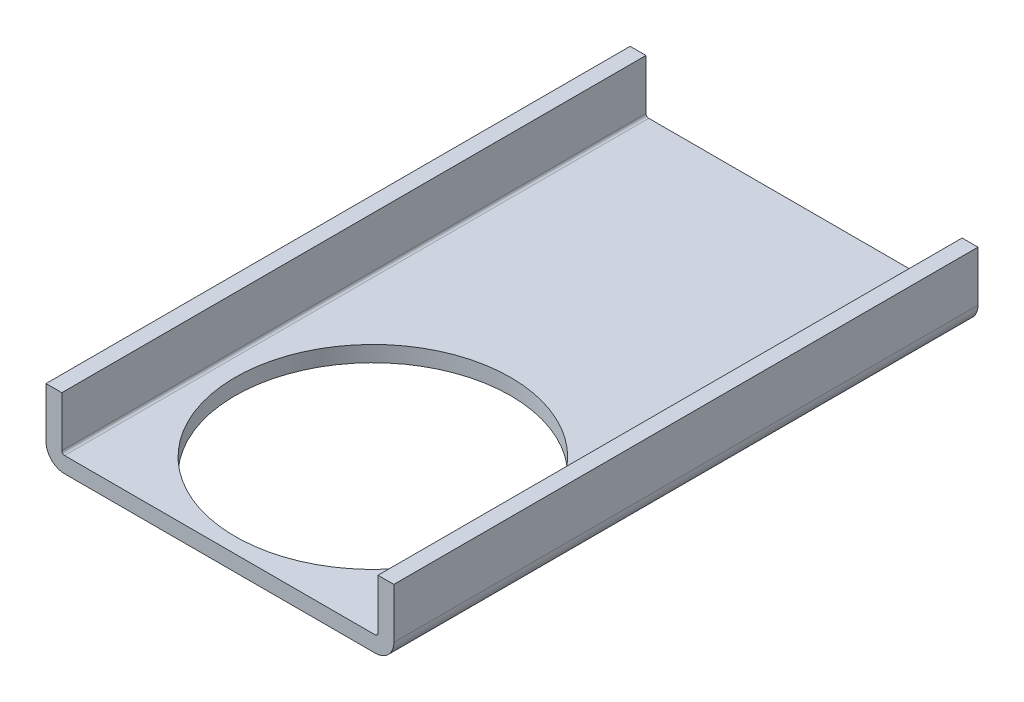
ISO-10303-21;
HEADER;
FILE_DESCRIPTION(('STEP AP214'),'2;1');
FILE_NAME('part.step','',(''),(''),'','','');
FILE_SCHEMA(('AUTOMOTIVE_DESIGN { 1 0 10303 214 1 1 1 1 }'));
ENDSEC;
DATA;
#1=APPLICATION_CONTEXT('core data for automotive mechanical design processes');
#2=APPLICATION_PROTOCOL_DEFINITION('international standard','automotive_design',2000,#1);
#3=PRODUCT_CONTEXT('',#1,'mechanical');
#4=PRODUCT('Part','Part','',(#3));
#5=PRODUCT_RELATED_PRODUCT_CATEGORY('part','',(#4));
#6=PRODUCT_DEFINITION_FORMATION('','',#4);
#7=PRODUCT_DEFINITION_CONTEXT('part definition',#1,'design');
#8=PRODUCT_DEFINITION('design','',#6,#7);
#9=PRODUCT_DEFINITION_SHAPE('','',#8);
#10=(LENGTH_UNIT() NAMED_UNIT(*) SI_UNIT(.MILLI.,.METRE.));
#11=(NAMED_UNIT(*) PLANE_ANGLE_UNIT() SI_UNIT($,.RADIAN.));
#12=(NAMED_UNIT(*) SI_UNIT($,.STERADIAN.) SOLID_ANGLE_UNIT());
#13=UNCERTAINTY_MEASURE_WITH_UNIT(LENGTH_MEASURE(1.E-05),#10,'distance_accuracy_value','');
#14=(GEOMETRIC_REPRESENTATION_CONTEXT(3) GLOBAL_UNCERTAINTY_ASSIGNED_CONTEXT((#13)) GLOBAL_UNIT_ASSIGNED_CONTEXT((#10,
#11,#12)) REPRESENTATION_CONTEXT('',''));
#15=CARTESIAN_POINT('',(0.,0.,0.));
#16=DIRECTION('',(0.,0.,1.));
#17=DIRECTION('',(1.,0.,0.));
#18=AXIS2_PLACEMENT_3D('',#15,#16,#17);
#19=CARTESIAN_POINT('',(28.6385,0.507999999999995,29.464));
#20=DIRECTION('',(0.,0.,-1.));
#21=DIRECTION('',(-1.,0.,0.));
#22=AXIS2_PLACEMENT_3D('',#19,#20,#21);
#23=CYLINDRICAL_SURFACE('',#22,0.508000000000002);
#24=CARTESIAN_POINT('',(28.6385,0.507999999999993,-79.502));
#25=DIRECTION('',(0.,0.,-1.));
#26=DIRECTION('',(-1.,0.,0.));
#27=AXIS2_PLACEMENT_3D('',#24,#25,#26);
#28=CIRCLE('',#27,0.508000000000002);
#29=CARTESIAN_POINT('',(28.6385,0.,-79.502));
#30=VERTEX_POINT('',#29);
#31=CARTESIAN_POINT('',(29.1465,0.507999999999994,-79.502));
#32=VERTEX_POINT('',#31);
#33=EDGE_CURVE('E93',#30,#32,#28,.F.);
#34=ORIENTED_EDGE('',*,*,#33,.F.);
#35=DIRECTION('',(0.,0.,-1.));
#36=VECTOR('',#35,1.);
#37=CARTESIAN_POINT('',(28.6385,0.,29.464));
#38=LINE('',#37,#36);
#39=CARTESIAN_POINT('',(28.6385,0.,28.194));
#40=VERTEX_POINT('',#39);
#41=EDGE_CURVE('E95',#30,#40,#38,.F.);
#42=ORIENTED_EDGE('',*,*,#41,.T.);
#43=CARTESIAN_POINT('',(28.6385,0.507999999999995,28.194));
#44=DIRECTION('',(0.,0.,-1.));
#45=DIRECTION('',(-1.,0.,0.));
#46=AXIS2_PLACEMENT_3D('',#43,#44,#45);
#47=CIRCLE('',#46,0.508000000000002);
#48=CARTESIAN_POINT('',(29.1465,0.507999999999995,28.194));
#49=VERTEX_POINT('',#48);
#50=EDGE_CURVE('E19',#49,#40,#47,.T.);
#51=ORIENTED_EDGE('',*,*,#50,.F.);
#52=DIRECTION('',(0.,0.,-1.));
#53=VECTOR('',#52,1.);
#54=CARTESIAN_POINT('',(29.1465,0.507999999999995,29.464));
#55=LINE('',#54,#53);
#56=EDGE_CURVE('E147',#49,#32,#55,.T.);
#57=ORIENTED_EDGE('',*,*,#56,.T.);
#58=EDGE_LOOP('',(#34,#42,#51,#57));
#59=FACE_BOUND('',#58,.T.);
#60=ADVANCED_FACE('F16',(#59),#23,.F.);
#61=CARTESIAN_POINT('',(-28.6385000000001,0.507999999999989,29.464));
#62=DIRECTION('',(0.,0.,-1.));
#63=DIRECTION('',(-1.,0.,0.));
#64=AXIS2_PLACEMENT_3D('',#61,#62,#63);
#65=CYLINDRICAL_SURFACE('',#64,0.508000000000002);
#66=CARTESIAN_POINT('',(-28.6385,0.507999999999988,-79.5020000000001));
#67=DIRECTION('',(0.,0.,-1.));
#68=DIRECTION('',(-1.,0.,0.));
#69=AXIS2_PLACEMENT_3D('',#66,#67,#68);
#70=CIRCLE('',#69,0.508000000000002);
#71=CARTESIAN_POINT('',(-29.1465,0.507999999999989,-79.502));
#72=VERTEX_POINT('',#71);
#73=CARTESIAN_POINT('',(-28.6385,0.,-79.502));
#74=VERTEX_POINT('',#73);
#75=EDGE_CURVE('E162',#72,#74,#70,.F.);
#76=ORIENTED_EDGE('',*,*,#75,.F.);
#77=DIRECTION('',(0.,0.,1.));
#78=VECTOR('',#77,1.);
#79=CARTESIAN_POINT('',(-29.1465,0.507999999999989,29.464));
#80=LINE('',#79,#78);
#81=CARTESIAN_POINT('',(-29.1465,0.50799999999999,28.194));
#82=VERTEX_POINT('',#81);
#83=EDGE_CURVE('E99',#72,#82,#80,.T.);
#84=ORIENTED_EDGE('',*,*,#83,.T.);
#85=CARTESIAN_POINT('',(-28.6385000000001,0.507999999999989,28.194));
#86=DIRECTION('',(0.,0.,-1.));
#87=DIRECTION('',(-1.,0.,0.));
#88=AXIS2_PLACEMENT_3D('',#85,#86,#87);
#89=CIRCLE('',#88,0.508000000000002);
#90=CARTESIAN_POINT('',(-28.6385,0.,28.194));
#91=VERTEX_POINT('',#90);
#92=EDGE_CURVE('E192',#91,#82,#89,.T.);
#93=ORIENTED_EDGE('',*,*,#92,.F.);
#94=DIRECTION('',(0.,0.,-1.));
#95=VECTOR('',#94,1.);
#96=CARTESIAN_POINT('',(-28.6385,0.,29.464));
#97=LINE('',#96,#95);
#98=EDGE_CURVE('E100',#91,#74,#97,.T.);
#99=ORIENTED_EDGE('',*,*,#98,.T.);
#100=EDGE_LOOP('',(#76,#84,#93,#99));
#101=FACE_BOUND('',#100,.T.);
#102=ADVANCED_FACE('F297',(#101),#65,.F.);
#103=CARTESIAN_POINT('',(32.0675,0.507999999999993,29.464));
#104=DIRECTION('',(-1.,0.,0.));
#105=DIRECTION('',(0.,0.,1.));
#106=AXIS2_PLACEMENT_3D('',#103,#104,#105);
#107=PLANE('',#106);
#108=DIRECTION('',(0.,1.,0.));
#109=VECTOR('',#108,1.);
#110=CARTESIAN_POINT('',(32.0675,22.479,-79.502));
#111=LINE('',#110,#109);
#112=CARTESIAN_POINT('',(32.0675,0.507999999999994,-79.502));
#113=VERTEX_POINT('',#112);
#114=CARTESIAN_POINT('',(32.0675,9.77899999999999,-79.502));
#115=VERTEX_POINT('',#114);
#116=EDGE_CURVE('E157',#113,#115,#111,.T.);
#117=ORIENTED_EDGE('',*,*,#116,.T.);
#118=DIRECTION('',(0.,0.,-1.));
#119=VECTOR('',#118,1.);
#120=CARTESIAN_POINT('',(32.0675,9.77899999999999,29.464));
#121=LINE('',#120,#119);
#122=CARTESIAN_POINT('',(32.0675,9.77899999999999,28.194));
#123=VERTEX_POINT('',#122);
#124=EDGE_CURVE('E149',#115,#123,#121,.F.);
#125=ORIENTED_EDGE('',*,*,#124,.T.);
#126=DIRECTION('',(0.,1.,0.));
#127=VECTOR('',#126,1.);
#128=CARTESIAN_POINT('',(32.0675,22.479,28.194));
#129=LINE('',#128,#127);
#130=CARTESIAN_POINT('',(32.0675,0.507999999999995,28.194));
#131=VERTEX_POINT('',#130);
#132=EDGE_CURVE('E168',#123,#131,#129,.F.);
#133=ORIENTED_EDGE('',*,*,#132,.T.);
#134=DIRECTION('',(0.,0.,-1.));
#135=VECTOR('',#134,1.);
#136=CARTESIAN_POINT('',(32.0675,0.507999999999995,29.464));
#137=LINE('',#136,#135);
#138=EDGE_CURVE('E165',#113,#131,#137,.F.);
#139=ORIENTED_EDGE('',*,*,#138,.F.);
#140=EDGE_LOOP('',(#117,#125,#133,#139));
#141=FACE_BOUND('',#140,.T.);
#142=ADVANCED_FACE('F225',(#141),#107,.F.);
#143=CARTESIAN_POINT('',(32.0675,9.77899999999999,29.464));
#144=DIRECTION('',(0.,-1.,0.));
#145=DIRECTION('',(0.,0.,-1.));
#146=AXIS2_PLACEMENT_3D('',#143,#144,#145);
#147=PLANE('',#146);
#148=DIRECTION('',(1.,0.,0.));
#149=VECTOR('',#148,1.);
#150=CARTESIAN_POINT('',(50.8,9.779,-79.502));
#151=LINE('',#150,#149);
#152=CARTESIAN_POINT('',(29.1465,9.77899999999999,-79.502));
#153=VERTEX_POINT('',#152);
#154=EDGE_CURVE('E153',#115,#153,#151,.F.);
#155=ORIENTED_EDGE('',*,*,#154,.T.);
#156=DIRECTION('',(0.,0.,-1.));
#157=VECTOR('',#156,1.);
#158=CARTESIAN_POINT('',(29.1465,9.77899999999999,29.464));
#159=LINE('',#158,#157);
#160=CARTESIAN_POINT('',(29.1465,9.77899999999999,28.194));
#161=VERTEX_POINT('',#160);
#162=EDGE_CURVE('E146',#153,#161,#159,.F.);
#163=ORIENTED_EDGE('',*,*,#162,.T.);
#164=DIRECTION('',(-1.,0.,0.));
#165=VECTOR('',#164,1.);
#166=CARTESIAN_POINT('',(50.8,9.77899999999999,28.194));
#167=LINE('',#166,#165);
#168=EDGE_CURVE('E108',#161,#123,#167,.F.);
#169=ORIENTED_EDGE('',*,*,#168,.T.);
#170=ORIENTED_EDGE('',*,*,#124,.F.);
#171=EDGE_LOOP('',(#155,#163,#169,#170));
#172=FACE_BOUND('',#171,.T.);
#173=ADVANCED_FACE('F293',(#172),#147,.F.);
#174=CARTESIAN_POINT('',(29.1465,0.507999999999995,29.464));
#175=DIRECTION('',(1.,0.,0.));
#176=DIRECTION('',(0.,0.,-1.));
#177=AXIS2_PLACEMENT_3D('',#174,#175,#176);
#178=PLANE('',#177);
#179=DIRECTION('',(0.,1.,0.));
#180=VECTOR('',#179,1.);
#181=CARTESIAN_POINT('',(29.1465,22.479,-79.502));
#182=LINE('',#181,#180);
#183=EDGE_CURVE('E156',#153,#32,#182,.F.);
#184=ORIENTED_EDGE('',*,*,#183,.T.);
#185=ORIENTED_EDGE('',*,*,#56,.F.);
#186=DIRECTION('',(0.,1.,0.));
#187=VECTOR('',#186,1.);
#188=CARTESIAN_POINT('',(29.1465,22.479,28.194));
#189=LINE('',#188,#187);
#190=EDGE_CURVE('E92',#49,#161,#189,.T.);
#191=ORIENTED_EDGE('',*,*,#190,.T.);
#192=ORIENTED_EDGE('',*,*,#162,.F.);
#193=EDGE_LOOP('',(#184,#185,#191,#192));
#194=FACE_BOUND('',#193,.T.);
#195=ADVANCED_FACE('F202',(#194),#178,.F.);
#196=CARTESIAN_POINT('',(28.6385,0.,29.464));
#197=DIRECTION('',(0.,-1.,0.));
#198=DIRECTION('',(0.,0.,-1.));
#199=AXIS2_PLACEMENT_3D('',#196,#197,#198);
#200=PLANE('',#199);
#201=DIRECTION('',(1.,0.,0.));
#202=VECTOR('',#201,1.);
#203=CARTESIAN_POINT('',(50.8,0.,-79.502));
#204=LINE('',#203,#202);
#205=EDGE_CURVE('E199',#30,#74,#204,.F.);
#206=ORIENTED_EDGE('',*,*,#205,.T.);
#207=ORIENTED_EDGE('',*,*,#98,.F.);
#208=DIRECTION('',(-1.,0.,0.));
#209=VECTOR('',#208,1.);
#210=CARTESIAN_POINT('',(50.8,0.,28.194));
#211=LINE('',#210,#209);
#212=EDGE_CURVE('E89',#91,#40,#211,.F.);
#213=ORIENTED_EDGE('',*,*,#212,.T.);
#214=ORIENTED_EDGE('',*,*,#41,.F.);
#215=EDGE_LOOP('',(#206,#207,#213,#214));
#216=FACE_BOUND('',#215,.T.);
#217=CARTESIAN_POINT('',(0.,0.,0.));
#218=DIRECTION('',(0.,-1.,0.));
#219=DIRECTION('',(0.,0.,-1.));
#220=AXIS2_PLACEMENT_3D('',#217,#218,#219);
#221=CIRCLE('',#220,25.4);
#222=CARTESIAN_POINT('',(0.,0.,-25.4));
#223=VERTEX_POINT('',#222);
#224=EDGE_CURVE('E121',#223,#223,#221,.T.);
#225=ORIENTED_EDGE('',*,*,#224,.T.);
#226=EDGE_LOOP('',(#225));
#227=FACE_BOUND('',#226,.T.);
#228=ADVANCED_FACE('F103',(#216,#227),#200,.F.);
#229=CARTESIAN_POINT('',(-29.1465,0.507999999999989,29.464));
#230=DIRECTION('',(-1.,0.,0.));
#231=DIRECTION('',(0.,0.,1.));
#232=AXIS2_PLACEMENT_3D('',#229,#230,#231);
#233=PLANE('',#232);
#234=DIRECTION('',(0.,1.,0.));
#235=VECTOR('',#234,1.);
#236=CARTESIAN_POINT('',(-29.1465000000001,22.479,-79.502));
#237=LINE('',#236,#235);
#238=CARTESIAN_POINT('',(-29.1465,9.77899999999999,-79.502));
#239=VERTEX_POINT('',#238);
#240=EDGE_CURVE('E136',#72,#239,#237,.T.);
#241=ORIENTED_EDGE('',*,*,#240,.T.);
#242=DIRECTION('',(0.,0.,-1.));
#243=VECTOR('',#242,1.);
#244=CARTESIAN_POINT('',(-29.1465,9.77899999999999,29.464));
#245=LINE('',#244,#243);
#246=CARTESIAN_POINT('',(-29.1465,9.77899999999999,28.194));
#247=VERTEX_POINT('',#246);
#248=EDGE_CURVE('E130',#239,#247,#245,.F.);
#249=ORIENTED_EDGE('',*,*,#248,.T.);
#250=DIRECTION('',(0.,1.,0.));
#251=VECTOR('',#250,1.);
#252=CARTESIAN_POINT('',(-29.1465,22.479,28.194));
#253=LINE('',#252,#251);
#254=EDGE_CURVE('E106',#247,#82,#253,.F.);
#255=ORIENTED_EDGE('',*,*,#254,.T.);
#256=ORIENTED_EDGE('',*,*,#83,.F.);
#257=EDGE_LOOP('',(#241,#249,#255,#256));
#258=FACE_BOUND('',#257,.T.);
#259=ADVANCED_FACE('F286',(#258),#233,.F.);
#260=CARTESIAN_POINT('',(-32.0675,9.77899999999999,29.464));
#261=DIRECTION('',(0.,-1.,0.));
#262=DIRECTION('',(0.,0.,-1.));
#263=AXIS2_PLACEMENT_3D('',#260,#261,#262);
#264=PLANE('',#263);
#265=DIRECTION('',(1.,0.,0.));
#266=VECTOR('',#265,1.);
#267=CARTESIAN_POINT('',(50.8,9.77899999999999,-79.502));
#268=LINE('',#267,#266);
#269=CARTESIAN_POINT('',(-32.0675,9.77899999999999,-79.502));
#270=VERTEX_POINT('',#269);
#271=EDGE_CURVE('E133',#239,#270,#268,.F.);
#272=ORIENTED_EDGE('',*,*,#271,.T.);
#273=DIRECTION('',(0.,0.,-1.));
#274=VECTOR('',#273,1.);
#275=CARTESIAN_POINT('',(-32.0675,9.77899999999999,29.464));
#276=LINE('',#275,#274);
#277=CARTESIAN_POINT('',(-32.0675,9.77899999999999,28.194));
#278=VERTEX_POINT('',#277);
#279=EDGE_CURVE('E127',#270,#278,#276,.F.);
#280=ORIENTED_EDGE('',*,*,#279,.T.);
#281=DIRECTION('',(-1.,0.,0.));
#282=VECTOR('',#281,1.);
#283=CARTESIAN_POINT('',(50.8,9.77899999999999,28.194));
#284=LINE('',#283,#282);
#285=EDGE_CURVE('E111',#278,#247,#284,.F.);
#286=ORIENTED_EDGE('',*,*,#285,.T.);
#287=ORIENTED_EDGE('',*,*,#248,.F.);
#288=EDGE_LOOP('',(#272,#280,#286,#287));
#289=FACE_BOUND('',#288,.T.);
#290=ADVANCED_FACE('F260',(#289),#264,.F.);
#291=CARTESIAN_POINT('',(-32.0675,0.507999999999991,29.464));
#292=DIRECTION('',(1.,0.,0.));
#293=DIRECTION('',(0.,0.,-1.));
#294=AXIS2_PLACEMENT_3D('',#291,#292,#293);
#295=PLANE('',#294);
#296=DIRECTION('',(0.,1.,0.));
#297=VECTOR('',#296,1.);
#298=CARTESIAN_POINT('',(-32.0675,22.479,-79.502));
#299=LINE('',#298,#297);
#300=CARTESIAN_POINT('',(-32.0675,0.507999999999988,-79.502));
#301=VERTEX_POINT('',#300);
#302=EDGE_CURVE('E126',#270,#301,#299,.F.);
#303=ORIENTED_EDGE('',*,*,#302,.T.);
#304=DIRECTION('',(0.,0.,-1.));
#305=VECTOR('',#304,1.);
#306=CARTESIAN_POINT('',(-32.0675000000001,0.507999999999989,29.464));
#307=LINE('',#306,#305);
#308=CARTESIAN_POINT('',(-32.0675000000001,0.50799999999999,28.194));
#309=VERTEX_POINT('',#308);
#310=EDGE_CURVE('E124',#309,#301,#307,.T.);
#311=ORIENTED_EDGE('',*,*,#310,.F.);
#312=DIRECTION('',(0.,1.,0.));
#313=VECTOR('',#312,1.);
#314=CARTESIAN_POINT('',(-32.0675,22.479,28.194));
#315=LINE('',#314,#313);
#316=EDGE_CURVE('E118',#309,#278,#315,.T.);
#317=ORIENTED_EDGE('',*,*,#316,.T.);
#318=ORIENTED_EDGE('',*,*,#279,.F.);
#319=EDGE_LOOP('',(#303,#311,#317,#318));
#320=FACE_BOUND('',#319,.T.);
#321=ADVANCED_FACE('F262',(#320),#295,.F.);
#322=CARTESIAN_POINT('',(0.,22.479,0.));
#323=DIRECTION('',(0.,-1.,0.));
#324=DIRECTION('',(0.,0.,-1.));
#325=AXIS2_PLACEMENT_3D('',#322,#323,#324);
#326=CYLINDRICAL_SURFACE('',#325,25.4);
#327=ORIENTED_EDGE('',*,*,#224,.F.);
#328=EDGE_LOOP('',(#327));
#329=FACE_BOUND('',#328,.T.);
#330=CARTESIAN_POINT('',(0.,-2.92100000000001,0.));
#331=DIRECTION('',(0.,-1.,0.));
#332=DIRECTION('',(0.,0.,-1.));
#333=AXIS2_PLACEMENT_3D('',#330,#331,#332);
#334=CIRCLE('',#333,25.4);
#335=CARTESIAN_POINT('',(0.,-2.92100000000001,-25.4));
#336=VERTEX_POINT('',#335);
#337=EDGE_CURVE('E177',#336,#336,#334,.T.);
#338=ORIENTED_EDGE('',*,*,#337,.T.);
#339=EDGE_LOOP('',(#338));
#340=FACE_BOUND('',#339,.T.);
#341=ADVANCED_FACE('F278',(#329,#340),#326,.F.);
#342=CARTESIAN_POINT('',(50.8,22.479,28.194));
#343=DIRECTION('',(0.,0.,-1.));
#344=DIRECTION('',(-1.,0.,0.));
#345=AXIS2_PLACEMENT_3D('',#342,#343,#344);
#346=PLANE('',#345);
#347=CARTESIAN_POINT('',(28.6385,0.507999999999995,28.194));
#348=DIRECTION('',(0.,0.,-1.));
#349=DIRECTION('',(-1.,0.,0.));
#350=AXIS2_PLACEMENT_3D('',#347,#348,#349);
#351=CIRCLE('',#350,3.42900000000001);
#352=CARTESIAN_POINT('',(28.6385,-2.92100000000001,28.194));
#353=VERTEX_POINT('',#352);
#354=EDGE_CURVE('E167',#131,#353,#351,.T.);
#355=ORIENTED_EDGE('',*,*,#354,.F.);
#356=ORIENTED_EDGE('',*,*,#132,.F.);
#357=ORIENTED_EDGE('',*,*,#168,.F.);
#358=ORIENTED_EDGE('',*,*,#190,.F.);
#359=ORIENTED_EDGE('',*,*,#50,.T.);
#360=ORIENTED_EDGE('',*,*,#212,.F.);
#361=ORIENTED_EDGE('',*,*,#92,.T.);
#362=ORIENTED_EDGE('',*,*,#254,.F.);
#363=ORIENTED_EDGE('',*,*,#285,.F.);
#364=ORIENTED_EDGE('',*,*,#316,.F.);
#365=CARTESIAN_POINT('',(-28.6385000000001,0.507999999999989,28.194));
#366=DIRECTION('',(0.,0.,-1.));
#367=DIRECTION('',(-1.,0.,0.));
#368=AXIS2_PLACEMENT_3D('',#365,#366,#367);
#369=CIRCLE('',#368,3.42900000000001);
#370=CARTESIAN_POINT('',(-28.6385,-2.92100000000001,28.194));
#371=VERTEX_POINT('',#370);
#372=EDGE_CURVE('E181',#371,#309,#369,.T.);
#373=ORIENTED_EDGE('',*,*,#372,.F.);
#374=DIRECTION('',(1.,0.,0.));
#375=VECTOR('',#374,1.);
#376=CARTESIAN_POINT('',(28.6385,-2.92100000000001,28.194));
#377=LINE('',#376,#375);
#378=EDGE_CURVE('E180',#371,#353,#377,.T.);
#379=ORIENTED_EDGE('',*,*,#378,.T.);
#380=EDGE_LOOP('',(#355,#356,#357,#358,#359,#360,#361,#362,#363,#364,#373,#379));
#381=FACE_BOUND('',#380,.T.);
#382=ADVANCED_FACE('F87',(#381),#346,.F.);
#383=CARTESIAN_POINT('',(28.6385,0.507999999999995,29.464));
#384=DIRECTION('',(0.,0.,-1.));
#385=DIRECTION('',(-1.,0.,0.));
#386=AXIS2_PLACEMENT_3D('',#383,#384,#385);
#387=CYLINDRICAL_SURFACE('',#386,3.42900000000001);
#388=ORIENTED_EDGE('',*,*,#138,.T.);
#389=ORIENTED_EDGE('',*,*,#354,.T.);
#390=DIRECTION('',(0.,0.,1.));
#391=VECTOR('',#390,1.);
#392=CARTESIAN_POINT('',(28.6385,-2.92100000000001,29.464));
#393=LINE('',#392,#391);
#394=CARTESIAN_POINT('',(28.6385,-2.92100000000001,-79.502));
#395=VERTEX_POINT('',#394);
#396=EDGE_CURVE('E213',#353,#395,#393,.F.);
#397=ORIENTED_EDGE('',*,*,#396,.T.);
#398=CARTESIAN_POINT('',(28.6385,0.507999999999993,-79.502));
#399=DIRECTION('',(0.,0.,-1.));
#400=DIRECTION('',(-1.,0.,0.));
#401=AXIS2_PLACEMENT_3D('',#398,#399,#400);
#402=CIRCLE('',#401,3.42900000000001);
#403=EDGE_CURVE('E185',#395,#113,#402,.F.);
#404=ORIENTED_EDGE('',*,*,#403,.T.);
#405=EDGE_LOOP('',(#388,#389,#397,#404));
#406=FACE_BOUND('',#405,.T.);
#407=ADVANCED_FACE('F232',(#406),#387,.T.);
#408=CARTESIAN_POINT('',(50.8,22.479,-79.502));
#409=DIRECTION('',(0.,0.,1.));
#410=DIRECTION('',(1.,0.,0.));
#411=AXIS2_PLACEMENT_3D('',#408,#409,#410);
#412=PLANE('',#411);
#413=ORIENTED_EDGE('',*,*,#271,.F.);
#414=ORIENTED_EDGE('',*,*,#240,.F.);
#415=ORIENTED_EDGE('',*,*,#75,.T.);
#416=ORIENTED_EDGE('',*,*,#205,.F.);
#417=ORIENTED_EDGE('',*,*,#33,.T.);
#418=ORIENTED_EDGE('',*,*,#183,.F.);
#419=ORIENTED_EDGE('',*,*,#154,.F.);
#420=ORIENTED_EDGE('',*,*,#116,.F.);
#421=ORIENTED_EDGE('',*,*,#403,.F.);
#422=DIRECTION('',(1.,0.,0.));
#423=VECTOR('',#422,1.);
#424=CARTESIAN_POINT('',(28.6385,-2.92100000000001,-79.502));
#425=LINE('',#424,#423);
#426=CARTESIAN_POINT('',(-28.6385,-2.92100000000001,-79.502));
#427=VERTEX_POINT('',#426);
#428=EDGE_CURVE('E25',#395,#427,#425,.F.);
#429=ORIENTED_EDGE('',*,*,#428,.T.);
#430=CARTESIAN_POINT('',(-28.6385,0.507999999999988,-79.5020000000001));
#431=DIRECTION('',(0.,0.,-1.));
#432=DIRECTION('',(-1.,0.,0.));
#433=AXIS2_PLACEMENT_3D('',#430,#431,#432);
#434=CIRCLE('',#433,3.42900000000001);
#435=EDGE_CURVE('E33',#301,#427,#434,.F.);
#436=ORIENTED_EDGE('',*,*,#435,.F.);
#437=ORIENTED_EDGE('',*,*,#302,.F.);
#438=EDGE_LOOP('',(#413,#414,#415,#416,#417,#418,#419,#420,#421,#429,#436,#437));
#439=FACE_BOUND('',#438,.T.);
#440=ADVANCED_FACE('F196',(#439),#412,.F.);
#441=CARTESIAN_POINT('',(-28.6385000000001,0.507999999999989,29.464));
#442=DIRECTION('',(0.,0.,-1.));
#443=DIRECTION('',(-1.,0.,0.));
#444=AXIS2_PLACEMENT_3D('',#441,#442,#443);
#445=CYLINDRICAL_SURFACE('',#444,3.42900000000001);
#446=DIRECTION('',(0.,0.,1.));
#447=VECTOR('',#446,1.);
#448=CARTESIAN_POINT('',(-28.6385,-2.92100000000001,29.464));
#449=LINE('',#448,#447);
#450=EDGE_CURVE('E11',#427,#371,#449,.T.);
#451=ORIENTED_EDGE('',*,*,#450,.T.);
#452=ORIENTED_EDGE('',*,*,#372,.T.);
#453=ORIENTED_EDGE('',*,*,#310,.T.);
#454=ORIENTED_EDGE('',*,*,#435,.T.);
#455=EDGE_LOOP('',(#451,#452,#453,#454));
#456=FACE_BOUND('',#455,.T.);
#457=ADVANCED_FACE('F263',(#456),#445,.T.);
#458=CARTESIAN_POINT('',(28.6385,-2.92100000000001,29.464));
#459=DIRECTION('',(0.,1.,0.));
#460=DIRECTION('',(0.,0.,1.));
#461=AXIS2_PLACEMENT_3D('',#458,#459,#460);
#462=PLANE('',#461);
#463=ORIENTED_EDGE('',*,*,#428,.F.);
#464=ORIENTED_EDGE('',*,*,#396,.F.);
#465=ORIENTED_EDGE('',*,*,#378,.F.);
#466=ORIENTED_EDGE('',*,*,#450,.F.);
#467=EDGE_LOOP('',(#463,#464,#465,#466));
#468=FACE_BOUND('',#467,.T.);
#469=ORIENTED_EDGE('',*,*,#337,.F.);
#470=EDGE_LOOP('',(#469));
#471=FACE_BOUND('',#470,.T.);
#472=ADVANCED_FACE('F235',(#468,#471),#462,.F.);
#473=CLOSED_SHELL('',(#60,#102,#142,#173,#195,#228,#259,#290,#321,#341,#382,#407,#440,#457,#472));
#474=MANIFOLD_SOLID_BREP('B1',#473);
#475=ADVANCED_BREP_SHAPE_REPRESENTATION('',(#18,#474),#14);
#476=SHAPE_DEFINITION_REPRESENTATION(#9,#475);
ENDSEC;
END-ISO-10303-21;
